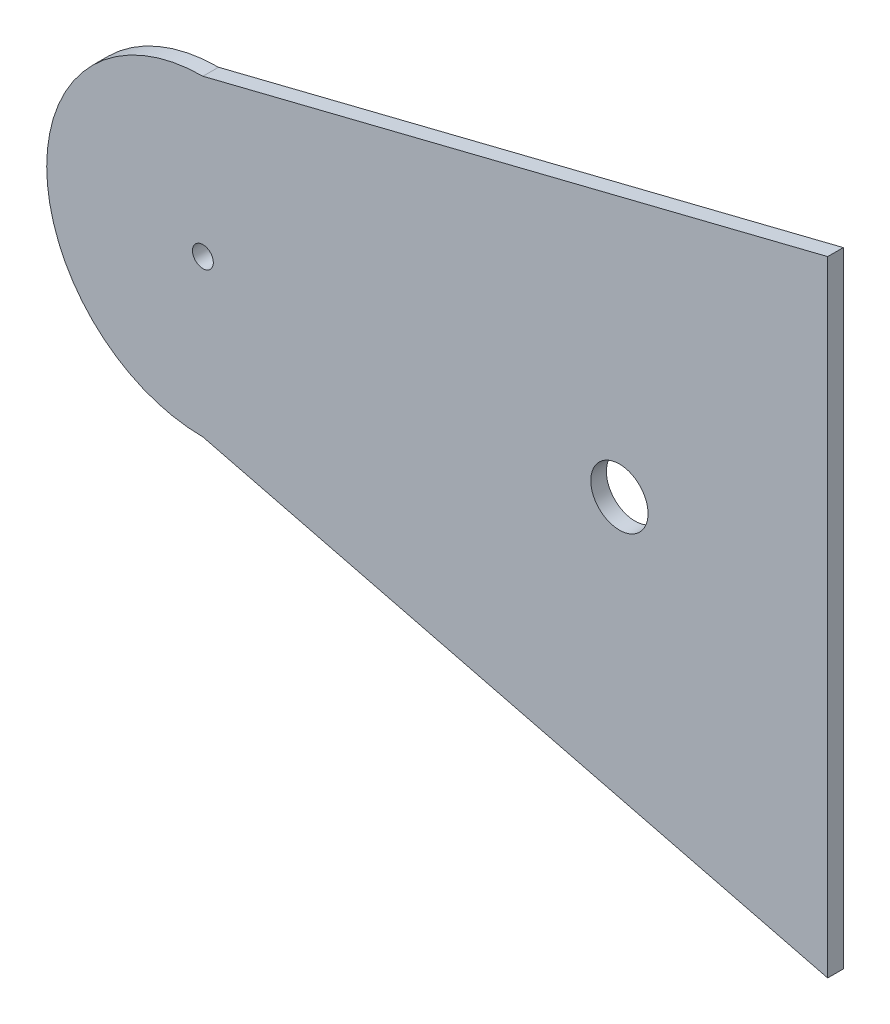
ISO-10303-21;
HEADER;
FILE_DESCRIPTION(('STEP AP214'),'2;1');
FILE_NAME('part.step','',(''),(''),'','','');
FILE_SCHEMA(('AUTOMOTIVE_DESIGN { 1 0 10303 214 1 1 1 1 }'));
ENDSEC;
DATA;
#1=APPLICATION_CONTEXT('core data for automotive mechanical design processes');
#2=APPLICATION_PROTOCOL_DEFINITION('international standard','automotive_design',2000,#1);
#3=PRODUCT_CONTEXT('',#1,'mechanical');
#4=PRODUCT('Part','Part','',(#3));
#5=PRODUCT_RELATED_PRODUCT_CATEGORY('part','',(#4));
#6=PRODUCT_DEFINITION_FORMATION('','',#4);
#7=PRODUCT_DEFINITION_CONTEXT('part definition',#1,'design');
#8=PRODUCT_DEFINITION('design','',#6,#7);
#9=PRODUCT_DEFINITION_SHAPE('','',#8);
#10=(LENGTH_UNIT() NAMED_UNIT(*) SI_UNIT(.MILLI.,.METRE.));
#11=(NAMED_UNIT(*) PLANE_ANGLE_UNIT() SI_UNIT($,.RADIAN.));
#12=(NAMED_UNIT(*) SI_UNIT($,.STERADIAN.) SOLID_ANGLE_UNIT());
#13=UNCERTAINTY_MEASURE_WITH_UNIT(LENGTH_MEASURE(1.E-05),#10,'distance_accuracy_value','');
#14=(GEOMETRIC_REPRESENTATION_CONTEXT(3) GLOBAL_UNCERTAINTY_ASSIGNED_CONTEXT((#13)) GLOBAL_UNIT_ASSIGNED_CONTEXT((#10,
#11,#12)) REPRESENTATION_CONTEXT('',''));
#15=CARTESIAN_POINT('',(0.,0.,0.));
#16=DIRECTION('',(0.,0.,1.));
#17=DIRECTION('',(1.,0.,0.));
#18=AXIS2_PLACEMENT_3D('',#15,#16,#17);
#19=CARTESIAN_POINT('',(174.00258186926,13.7078609778799,3.));
#20=DIRECTION('',(0.,0.,-1.));
#21=DIRECTION('',(-1.,0.,0.));
#22=AXIS2_PLACEMENT_3D('',#19,#20,#21);
#23=PLANE('',#22);
#24=CARTESIAN_POINT('',(174.00258186926,13.7078609778799,3.));
#25=DIRECTION('',(0.,0.,1.));
#26=DIRECTION('',(-1.,0.,0.));
#27=AXIS2_PLACEMENT_3D('',#24,#25,#26);
#28=CIRCLE('',#27,30.);
#29=CARTESIAN_POINT('',(174.00258186926,43.7078609778799,3.));
#30=VERTEX_POINT('',#29);
#31=CARTESIAN_POINT('',(174.00258186926,-16.2921390221201,3.));
#32=VERTEX_POINT('',#31);
#33=EDGE_CURVE('E86',#30,#32,#28,.T.);
#34=ORIENTED_EDGE('',*,*,#33,.T.);
#35=DIRECTION('',(0.970142500145332,-0.242535625036333,0.));
#36=VECTOR('',#35,1.);
#37=CARTESIAN_POINT('',(174.00258186926,-16.2921390221201,3.));
#38=LINE('',#37,#36);
#39=CARTESIAN_POINT('',(294.00258186926,-46.2921390221201,3.));
#40=VERTEX_POINT('',#39);
#41=EDGE_CURVE('E81',#32,#40,#38,.T.);
#42=ORIENTED_EDGE('',*,*,#41,.T.);
#43=DIRECTION('',(0.,1.,0.));
#44=VECTOR('',#43,1.);
#45=CARTESIAN_POINT('',(294.00258186926,13.7078609778799,3.));
#46=LINE('',#45,#44);
#47=CARTESIAN_POINT('',(294.00258186926,73.7078609778799,3.));
#48=VERTEX_POINT('',#47);
#49=EDGE_CURVE('E84',#40,#48,#46,.T.);
#50=ORIENTED_EDGE('',*,*,#49,.T.);
#51=DIRECTION('',(-0.970142500145332,-0.242535625036333,0.));
#52=VECTOR('',#51,1.);
#53=CARTESIAN_POINT('',(174.00258186926,43.7078609778799,3.));
#54=LINE('',#53,#52);
#55=EDGE_CURVE('E52',#48,#30,#54,.T.);
#56=ORIENTED_EDGE('',*,*,#55,.T.);
#57=EDGE_LOOP('',(#34,#42,#50,#56));
#58=FACE_BOUND('',#57,.T.);
#59=CARTESIAN_POINT('',(174.00258186926,13.7078609778799,3.));
#60=DIRECTION('',(0.,0.,1.));
#61=DIRECTION('',(1.,0.,0.));
#62=AXIS2_PLACEMENT_3D('',#59,#60,#61);
#63=CIRCLE('',#62,2.);
#64=CARTESIAN_POINT('',(176.00258186926,13.7078609778799,3.));
#65=VERTEX_POINT('',#64);
#66=EDGE_CURVE('E102',#65,#65,#63,.T.);
#67=ORIENTED_EDGE('',*,*,#66,.F.);
#68=EDGE_LOOP('',(#67));
#69=FACE_BOUND('',#68,.T.);
#70=CARTESIAN_POINT('',(254.00258186926,13.7078609778799,3.));
#71=DIRECTION('',(0.,0.,1.));
#72=DIRECTION('',(1.,0.,0.));
#73=AXIS2_PLACEMENT_3D('',#70,#71,#72);
#74=CIRCLE('',#73,5.50000000000002);
#75=CARTESIAN_POINT('',(259.50258186926,13.7078609778799,3.));
#76=VERTEX_POINT('',#75);
#77=EDGE_CURVE('E117',#76,#76,#74,.T.);
#78=ORIENTED_EDGE('',*,*,#77,.F.);
#79=EDGE_LOOP('',(#78));
#80=FACE_BOUND('',#79,.T.);
#81=ADVANCED_FACE('F35',(#58,#69,#80),#23,.F.);
#82=CARTESIAN_POINT('',(174.00258186926,13.7078609778799,0.));
#83=DIRECTION('',(0.,0.,-1.));
#84=DIRECTION('',(-1.,0.,0.));
#85=AXIS2_PLACEMENT_3D('',#82,#83,#84);
#86=PLANE('',#85);
#87=CARTESIAN_POINT('',(174.00258186926,13.7078609778799,0.));
#88=DIRECTION('',(0.,0.,1.));
#89=DIRECTION('',(1.,0.,0.));
#90=AXIS2_PLACEMENT_3D('',#87,#88,#89);
#91=CIRCLE('',#90,2.);
#92=CARTESIAN_POINT('',(176.00258186926,13.7078609778799,0.));
#93=VERTEX_POINT('',#92);
#94=EDGE_CURVE('E114',#93,#93,#91,.T.);
#95=ORIENTED_EDGE('',*,*,#94,.T.);
#96=EDGE_LOOP('',(#95));
#97=FACE_BOUND('',#96,.T.);
#98=CARTESIAN_POINT('',(174.00258186926,13.7078609778799,0.));
#99=DIRECTION('',(0.,0.,1.));
#100=DIRECTION('',(-1.,0.,0.));
#101=AXIS2_PLACEMENT_3D('',#98,#99,#100);
#102=CIRCLE('',#101,30.);
#103=CARTESIAN_POINT('',(174.00258186926,43.7078609778799,0.));
#104=VERTEX_POINT('',#103);
#105=CARTESIAN_POINT('',(174.00258186926,-16.2921390221201,0.));
#106=VERTEX_POINT('',#105);
#107=EDGE_CURVE('E99',#104,#106,#102,.T.);
#108=ORIENTED_EDGE('',*,*,#107,.F.);
#109=DIRECTION('',(-0.970142500145332,-0.242535625036333,0.));
#110=VECTOR('',#109,1.);
#111=CARTESIAN_POINT('',(174.00258186926,43.7078609778799,0.));
#112=LINE('',#111,#110);
#113=CARTESIAN_POINT('',(294.00258186926,73.7078609778799,0.));
#114=VERTEX_POINT('',#113);
#115=EDGE_CURVE('E74',#114,#104,#112,.T.);
#116=ORIENTED_EDGE('',*,*,#115,.F.);
#117=DIRECTION('',(0.,1.,0.));
#118=VECTOR('',#117,1.);
#119=CARTESIAN_POINT('',(294.00258186926,13.7078609778799,0.));
#120=LINE('',#119,#118);
#121=CARTESIAN_POINT('',(294.00258186926,-46.2921390221201,0.));
#122=VERTEX_POINT('',#121);
#123=EDGE_CURVE('E68',#122,#114,#120,.T.);
#124=ORIENTED_EDGE('',*,*,#123,.F.);
#125=DIRECTION('',(0.970142500145332,-0.242535625036333,0.));
#126=VECTOR('',#125,1.);
#127=CARTESIAN_POINT('',(174.00258186926,-16.2921390221201,0.));
#128=LINE('',#127,#126);
#129=EDGE_CURVE('E91',#106,#122,#128,.T.);
#130=ORIENTED_EDGE('',*,*,#129,.F.);
#131=EDGE_LOOP('',(#108,#116,#124,#130));
#132=FACE_BOUND('',#131,.T.);
#133=CARTESIAN_POINT('',(254.00258186926,13.7078609778799,0.));
#134=DIRECTION('',(0.,0.,1.));
#135=DIRECTION('',(1.,0.,0.));
#136=AXIS2_PLACEMENT_3D('',#133,#134,#135);
#137=CIRCLE('',#136,5.50000000000002);
#138=CARTESIAN_POINT('',(259.50258186926,13.7078609778799,0.));
#139=VERTEX_POINT('',#138);
#140=EDGE_CURVE('E120',#139,#139,#137,.T.);
#141=ORIENTED_EDGE('',*,*,#140,.T.);
#142=EDGE_LOOP('',(#141));
#143=FACE_BOUND('',#142,.T.);
#144=ADVANCED_FACE('F110',(#97,#132,#143),#86,.T.);
#145=CARTESIAN_POINT('',(174.00258186926,13.7078609778799,3.));
#146=DIRECTION('',(0.,0.,-1.));
#147=DIRECTION('',(-1.,0.,0.));
#148=AXIS2_PLACEMENT_3D('',#145,#146,#147);
#149=CYLINDRICAL_SURFACE('',#148,30.);
#150=ORIENTED_EDGE('',*,*,#107,.T.);
#151=DIRECTION('',(0.,0.,-1.));
#152=VECTOR('',#151,1.);
#153=CARTESIAN_POINT('',(174.00258186926,-16.2921390221201,3.));
#154=LINE('',#153,#152);
#155=EDGE_CURVE('E11',#32,#106,#154,.T.);
#156=ORIENTED_EDGE('',*,*,#155,.F.);
#157=ORIENTED_EDGE('',*,*,#33,.F.);
#158=DIRECTION('',(0.,0.,-1.));
#159=VECTOR('',#158,1.);
#160=CARTESIAN_POINT('',(174.00258186926,43.7078609778799,3.));
#161=LINE('',#160,#159);
#162=EDGE_CURVE('E95',#30,#104,#161,.T.);
#163=ORIENTED_EDGE('',*,*,#162,.T.);
#164=EDGE_LOOP('',(#150,#156,#157,#163));
#165=FACE_BOUND('',#164,.T.);
#166=ADVANCED_FACE('F37',(#165),#149,.T.);
#167=CARTESIAN_POINT('',(174.00258186926,-16.2921390221201,3.));
#168=DIRECTION('',(0.242535625036333,0.970142500145332,0.));
#169=DIRECTION('',(-0.970142500145332,0.242535625036333,0.));
#170=AXIS2_PLACEMENT_3D('',#167,#168,#169);
#171=PLANE('',#170);
#172=ORIENTED_EDGE('',*,*,#129,.T.);
#173=DIRECTION('',(0.,0.,-1.));
#174=VECTOR('',#173,1.);
#175=CARTESIAN_POINT('',(294.00258186926,-46.2921390221201,3.));
#176=LINE('',#175,#174);
#177=EDGE_CURVE('E44',#40,#122,#176,.T.);
#178=ORIENTED_EDGE('',*,*,#177,.F.);
#179=ORIENTED_EDGE('',*,*,#41,.F.);
#180=ORIENTED_EDGE('',*,*,#155,.T.);
#181=EDGE_LOOP('',(#172,#178,#179,#180));
#182=FACE_BOUND('',#181,.T.);
#183=ADVANCED_FACE('F90',(#182),#171,.F.);
#184=CARTESIAN_POINT('',(294.00258186926,13.7078609778799,3.));
#185=DIRECTION('',(-1.,0.,0.));
#186=DIRECTION('',(0.,0.,1.));
#187=AXIS2_PLACEMENT_3D('',#184,#185,#186);
#188=PLANE('',#187);
#189=ORIENTED_EDGE('',*,*,#123,.T.);
#190=DIRECTION('',(0.,0.,-1.));
#191=VECTOR('',#190,1.);
#192=CARTESIAN_POINT('',(294.00258186926,73.7078609778799,3.));
#193=LINE('',#192,#191);
#194=EDGE_CURVE('E92',#48,#114,#193,.T.);
#195=ORIENTED_EDGE('',*,*,#194,.F.);
#196=ORIENTED_EDGE('',*,*,#49,.F.);
#197=ORIENTED_EDGE('',*,*,#177,.T.);
#198=EDGE_LOOP('',(#189,#195,#196,#197));
#199=FACE_BOUND('',#198,.T.);
#200=ADVANCED_FACE('F93',(#199),#188,.F.);
#201=CARTESIAN_POINT('',(174.00258186926,43.7078609778799,3.));
#202=DIRECTION('',(0.242535625036333,-0.970142500145332,0.));
#203=DIRECTION('',(0.970142500145332,0.242535625036333,0.));
#204=AXIS2_PLACEMENT_3D('',#201,#202,#203);
#205=PLANE('',#204);
#206=ORIENTED_EDGE('',*,*,#115,.T.);
#207=ORIENTED_EDGE('',*,*,#162,.F.);
#208=ORIENTED_EDGE('',*,*,#55,.F.);
#209=ORIENTED_EDGE('',*,*,#194,.T.);
#210=EDGE_LOOP('',(#206,#207,#208,#209));
#211=FACE_BOUND('',#210,.T.);
#212=ADVANCED_FACE('F107',(#211),#205,.F.);
#213=CARTESIAN_POINT('',(174.00258186926,13.7078609778799,3.));
#214=DIRECTION('',(0.,0.,-1.));
#215=DIRECTION('',(-1.,0.,0.));
#216=AXIS2_PLACEMENT_3D('',#213,#214,#215);
#217=CYLINDRICAL_SURFACE('',#216,2.);
#218=ORIENTED_EDGE('',*,*,#66,.T.);
#219=EDGE_LOOP('',(#218));
#220=FACE_BOUND('',#219,.T.);
#221=ORIENTED_EDGE('',*,*,#94,.F.);
#222=EDGE_LOOP('',(#221));
#223=FACE_BOUND('',#222,.T.);
#224=ADVANCED_FACE('F137',(#220,#223),#217,.F.);
#225=CARTESIAN_POINT('',(254.00258186926,13.7078609778799,3.));
#226=DIRECTION('',(0.,0.,-1.));
#227=DIRECTION('',(-1.,0.,0.));
#228=AXIS2_PLACEMENT_3D('',#225,#226,#227);
#229=CYLINDRICAL_SURFACE('',#228,5.50000000000002);
#230=ORIENTED_EDGE('',*,*,#77,.T.);
#231=EDGE_LOOP('',(#230));
#232=FACE_BOUND('',#231,.T.);
#233=ORIENTED_EDGE('',*,*,#140,.F.);
#234=EDGE_LOOP('',(#233));
#235=FACE_BOUND('',#234,.T.);
#236=ADVANCED_FACE('F126',(#232,#235),#229,.F.);
#237=CLOSED_SHELL('',(#81,#144,#166,#183,#200,#212,#224,#236));
#238=MANIFOLD_SOLID_BREP('B2',#237);
#239=ADVANCED_BREP_SHAPE_REPRESENTATION('',(#18,#238),#14);
#240=SHAPE_DEFINITION_REPRESENTATION(#9,#239);
ENDSEC;
END-ISO-10303-21;
